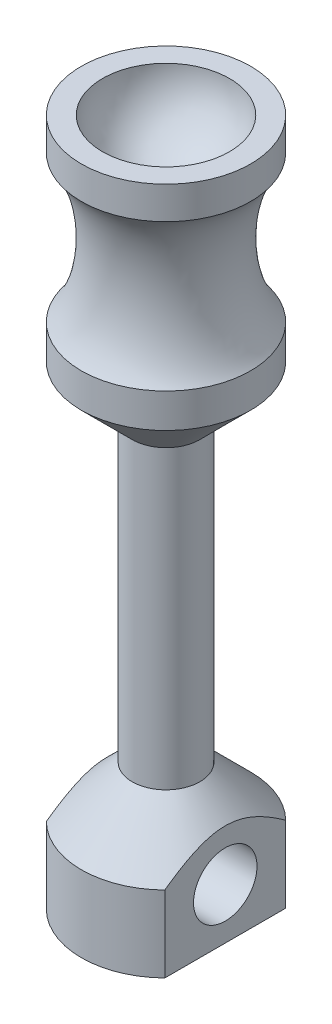
ISO-10303-21;
HEADER;
FILE_DESCRIPTION(('STEP AP214'),'2;1');
FILE_NAME('part.step','',(''),(''),'','','');
FILE_SCHEMA(('AUTOMOTIVE_DESIGN { 1 0 10303 214 1 1 1 1 }'));
ENDSEC;
DATA;
#1=APPLICATION_CONTEXT('core data for automotive mechanical design processes');
#2=APPLICATION_PROTOCOL_DEFINITION('international standard','automotive_design',2000,#1);
#3=PRODUCT_CONTEXT('',#1,'mechanical');
#4=PRODUCT('Part','Part','',(#3));
#5=PRODUCT_RELATED_PRODUCT_CATEGORY('part','',(#4));
#6=PRODUCT_DEFINITION_FORMATION('','',#4);
#7=PRODUCT_DEFINITION_CONTEXT('part definition',#1,'design');
#8=PRODUCT_DEFINITION('design','',#6,#7);
#9=PRODUCT_DEFINITION_SHAPE('','',#8);
#10=(LENGTH_UNIT() NAMED_UNIT(*) SI_UNIT(.MILLI.,.METRE.));
#11=(NAMED_UNIT(*) PLANE_ANGLE_UNIT() SI_UNIT($,.RADIAN.));
#12=(NAMED_UNIT(*) SI_UNIT($,.STERADIAN.) SOLID_ANGLE_UNIT());
#13=UNCERTAINTY_MEASURE_WITH_UNIT(LENGTH_MEASURE(1.E-05),#10,'distance_accuracy_value','');
#14=(GEOMETRIC_REPRESENTATION_CONTEXT(3) GLOBAL_UNCERTAINTY_ASSIGNED_CONTEXT((#13)) GLOBAL_UNIT_ASSIGNED_CONTEXT((#10,
#11,#12)) REPRESENTATION_CONTEXT('',''));
#15=CARTESIAN_POINT('',(0.,0.,0.));
#16=DIRECTION('',(0.,0.,1.));
#17=DIRECTION('',(1.,0.,0.));
#18=AXIS2_PLACEMENT_3D('',#15,#16,#17);
#19=CARTESIAN_POINT('',(0.,54.102,0.));
#20=DIRECTION('',(0.,1.,0.));
#21=DIRECTION('',(0.,0.,1.));
#22=AXIS2_PLACEMENT_3D('',#19,#20,#21);
#23=PLANE('',#22);
#24=CARTESIAN_POINT('',(0.,54.102,0.));
#25=DIRECTION('',(0.,1.,0.));
#26=DIRECTION('',(0.,0.,1.));
#27=AXIS2_PLACEMENT_3D('',#24,#25,#26);
#28=CIRCLE('',#27,6.34999999999999);
#29=CARTESIAN_POINT('',(0.,54.102,6.34999999999999));
#30=VERTEX_POINT('',#29);
#31=EDGE_CURVE('E107',#30,#30,#28,.T.);
#32=ORIENTED_EDGE('',*,*,#31,.T.);
#33=EDGE_LOOP('',(#32));
#34=FACE_BOUND('',#33,.T.);
#35=CARTESIAN_POINT('',(0.,54.102,0.));
#36=DIRECTION('',(0.,1.,0.));
#37=DIRECTION('',(0.,0.,1.));
#38=AXIS2_PLACEMENT_3D('',#35,#36,#37);
#39=CIRCLE('',#38,4.7625);
#40=CARTESIAN_POINT('',(0.,54.102,4.7625));
#41=VERTEX_POINT('',#40);
#42=EDGE_CURVE('E144',#41,#41,#39,.F.);
#43=ORIENTED_EDGE('',*,*,#42,.T.);
#44=EDGE_LOOP('',(#43));
#45=FACE_BOUND('',#44,.T.);
#46=ADVANCED_FACE('F32',(#34,#45),#23,.T.);
#47=CARTESIAN_POINT('',(0.,54.102,0.));
#48=DIRECTION('',(0.,-1.,0.));
#49=DIRECTION('',(0.,0.,-1.));
#50=AXIS2_PLACEMENT_3D('',#47,#48,#49);
#51=CYLINDRICAL_SURFACE('',#50,6.34999999999999);
#52=DIRECTION('',(0.,-1.,0.));
#53=VECTOR('',#52,1.);
#54=CARTESIAN_POINT('',(4.44499999999999,54.102,-4.53480705212471));
#55=LINE('',#54,#53);
#56=CARTESIAN_POINT('',(4.445,8.25500000000001,-4.53480705212471));
#57=VERTEX_POINT('',#56);
#58=CARTESIAN_POINT('',(4.445,2.53999999999995,-4.5348070521247));
#59=VERTEX_POINT('',#58);
#60=EDGE_CURVE('E81',#57,#59,#55,.T.);
#61=ORIENTED_EDGE('',*,*,#60,.T.);
#62=CARTESIAN_POINT('',(0.,2.53999999999995,0.));
#63=DIRECTION('',(0.,1.,0.));
#64=DIRECTION('',(-1.,0.,0.));
#65=AXIS2_PLACEMENT_3D('',#62,#63,#64);
#66=CIRCLE('',#65,6.34999999999999);
#67=CARTESIAN_POINT('',(-4.445,2.53999999999995,-4.53480705212471));
#68=VERTEX_POINT('',#67);
#69=EDGE_CURVE('E71',#59,#68,#66,.T.);
#70=ORIENTED_EDGE('',*,*,#69,.T.);
#71=DIRECTION('',(0.,-1.,0.));
#72=VECTOR('',#71,1.);
#73=CARTESIAN_POINT('',(-4.44499999999999,54.102,-4.53480705212471));
#74=LINE('',#73,#72);
#75=CARTESIAN_POINT('',(-4.445,8.25500000000001,-4.53480705212471));
#76=VERTEX_POINT('',#75);
#77=EDGE_CURVE('E78',#76,#68,#74,.T.);
#78=ORIENTED_EDGE('',*,*,#77,.F.);
#79=CARTESIAN_POINT('',(0.,8.25500000000001,0.));
#80=DIRECTION('',(0.,-1.,0.));
#81=DIRECTION('',(0.,0.,-1.));
#82=AXIS2_PLACEMENT_3D('',#79,#80,#81);
#83=CIRCLE('',#82,6.35);
#84=EDGE_CURVE('E103',#76,#57,#83,.T.);
#85=ORIENTED_EDGE('',*,*,#84,.T.);
#86=EDGE_LOOP('',(#61,#70,#78,#85));
#87=FACE_BOUND('',#86,.T.);
#88=ADVANCED_FACE('F77',(#87),#51,.T.);
#89=DIRECTION('',(0.,-1.,0.));
#90=VECTOR('',#89,1.);
#91=CARTESIAN_POINT('',(-4.44499999999999,54.102,4.53480705212471));
#92=LINE('',#91,#90);
#93=CARTESIAN_POINT('',(-4.44499999999999,2.53999999999995,4.53480705212471));
#94=VERTEX_POINT('',#93);
#95=CARTESIAN_POINT('',(-4.445,8.25500000000001,4.53480705212471));
#96=VERTEX_POINT('',#95);
#97=EDGE_CURVE('E53',#94,#96,#92,.F.);
#98=ORIENTED_EDGE('',*,*,#97,.F.);
#99=CARTESIAN_POINT('',(0.,2.53999999999995,0.));
#100=DIRECTION('',(0.,1.,0.));
#101=DIRECTION('',(-1.,0.,0.));
#102=AXIS2_PLACEMENT_3D('',#99,#100,#101);
#103=CIRCLE('',#102,6.34999999999999);
#104=CARTESIAN_POINT('',(4.445,2.53999999999995,4.5348070521247));
#105=VERTEX_POINT('',#104);
#106=EDGE_CURVE('E46',#94,#105,#103,.T.);
#107=ORIENTED_EDGE('',*,*,#106,.T.);
#108=DIRECTION('',(0.,-1.,0.));
#109=VECTOR('',#108,1.);
#110=CARTESIAN_POINT('',(4.44499999999999,54.102,4.53480705212471));
#111=LINE('',#110,#109);
#112=CARTESIAN_POINT('',(4.445,8.25500000000001,4.53480705212471));
#113=VERTEX_POINT('',#112);
#114=EDGE_CURVE('E86',#105,#113,#111,.F.);
#115=ORIENTED_EDGE('',*,*,#114,.T.);
#116=EDGE_CURVE('E104',#113,#96,#83,.T.);
#117=ORIENTED_EDGE('',*,*,#116,.T.);
#118=EDGE_LOOP('',(#98,#107,#115,#117));
#119=FACE_BOUND('',#118,.T.);
#120=ADVANCED_FACE('F131',(#119),#51,.T.);
#121=CARTESIAN_POINT('',(0.,12.065,0.));
#122=DIRECTION('',(0.,-1.,0.));
#123=DIRECTION('',(0.,0.,-1.));
#124=AXIS2_PLACEMENT_3D('',#121,#122,#123);
#125=CONICAL_SURFACE('',#124,2.54,0.78539816339745);
#126=CARTESIAN_POINT('',(0.,12.065,0.));
#127=DIRECTION('',(0.,-1.,0.));
#128=DIRECTION('',(0.,0.,-1.));
#129=AXIS2_PLACEMENT_3D('',#126,#127,#128);
#130=CIRCLE('',#129,2.54);
#131=CARTESIAN_POINT('',(0.,12.065,-2.54));
#132=VERTEX_POINT('',#131);
#133=EDGE_CURVE('E100',#132,#132,#130,.T.);
#134=ORIENTED_EDGE('',*,*,#133,.T.);
#135=EDGE_LOOP('',(#134));
#136=FACE_BOUND('',#135,.T.);
#137=CARTESIAN_POINT('',(-4.445,-13.1975543182403,-27.444926700917));
#138=CARTESIAN_POINT('',(-4.445,-12.4356043147273,-26.6730093962091));
#139=CARTESIAN_POINT('',(-4.445,-11.6740335414526,-25.9007167867327));
#140=CARTESIAN_POINT('',(-4.445,-10.1515073077864,-24.3545747801718));
#141=CARTESIAN_POINT('',(-4.445,-9.39055252907457,-23.5807247119152));
#142=CARTESIAN_POINT('',(-4.445,-7.86124948825217,-22.0226408137436));
#143=CARTESIAN_POINT('',(-4.445,-7.09291785227884,-21.2383906588543));
#144=CARTESIAN_POINT('',(-4.445,-5.55874112175718,-19.6684106319833));
#145=CARTESIAN_POINT('',(-4.445,-4.7928947810001,-18.8826819787317));
#146=CARTESIAN_POINT('',(-4.445,-3.46572491430304,-17.516052594965));
#147=CARTESIAN_POINT('',(-4.445,-2.90374047903993,-16.9357939142807));
#148=CARTESIAN_POINT('',(-4.445,-1.78184278094422,-15.7732027769578));
#149=CARTESIAN_POINT('',(-4.445,-1.22192965560374,-15.1908701875174));
#150=CARTESIAN_POINT('',(-4.445,-0.103788945365309,-14.0221065643028));
#151=CARTESIAN_POINT('',(-4.445,0.454432130423743,-13.4356692991482));
#152=CARTESIAN_POINT('',(-4.445,1.5665125834218,-12.2589337771987));
#153=CARTESIAN_POINT('',(-4.445,2.12037299541587,-11.6686365012191));
#154=CARTESIAN_POINT('',(-4.445,2.94369666465697,-10.7814556736336));
#155=CARTESIAN_POINT('',(-4.445,3.21561304606535,-10.4868497748998));
#156=CARTESIAN_POINT('',(-4.445,3.75740749413208,-9.89576918086259));
#157=CARTESIAN_POINT('',(-4.445,4.02728556555636,-9.59929448993174));
#158=CARTESIAN_POINT('',(-4.445,4.56468701133505,-9.00368792959814));
#159=CARTESIAN_POINT('',(-4.445,4.83220782938184,-8.70455374845096));
#160=CARTESIAN_POINT('',(-4.445,5.23087017514716,-8.25355681451988));
#161=CARTESIAN_POINT('',(-4.445,5.36331643274224,-8.10284734793688));
#162=CARTESIAN_POINT('',(-4.445,5.62719773312155,-7.80053480996339));
#163=CARTESIAN_POINT('',(-4.445,5.75863273426894,-7.64893170222778));
#164=CARTESIAN_POINT('',(-4.445,6.15008816117915,-7.19385028902806));
#165=CARTESIAN_POINT('',(-4.445,6.40835830006677,-6.88886129443041));
#166=CARTESIAN_POINT('',(-4.445,6.91835407187403,-6.27346091290103));
#167=CARTESIAN_POINT('',(-4.445,7.17008022848333,-5.96304996321199));
#168=CARTESIAN_POINT('',(-4.445,7.54026199846865,-5.49197696661505));
#169=CARTESIAN_POINT('',(-4.445,7.66233551988706,-5.33415959368159));
#170=CARTESIAN_POINT('',(-4.445,7.90349563886727,-5.01626278255211));
#171=CARTESIAN_POINT('',(-4.445,8.02258237117754,-4.85618344691539));
#172=CARTESIAN_POINT('',(-4.445,8.25698140488795,-4.53338954367256));
#173=CARTESIAN_POINT('',(-4.445,8.37229539151736,-4.37067620256233));
#174=CARTESIAN_POINT('',(-4.445,8.59820145584246,-4.04201286938058));
#175=CARTESIAN_POINT('',(-4.445,8.70879420725611,-3.87606334406779));
#176=CARTESIAN_POINT('',(-4.445,8.84558036098231,-3.66252786801582));
#177=CARTESIAN_POINT('',(-4.445,8.87459324262326,-3.61674129452419));
#178=CARTESIAN_POINT('',(-4.445,8.9321356323812,-3.52486163141856));
#179=CARTESIAN_POINT('',(-4.445,8.960665112801,-3.47876852445054));
#180=CARTESIAN_POINT('',(-4.445,9.0454795834033,-3.34000089531721));
#181=CARTESIAN_POINT('',(-4.445,9.10098457124759,-3.24684745206623));
#182=CARTESIAN_POINT('',(-4.445,9.20959648952546,-3.05912061113488));
#183=CARTESIAN_POINT('',(-4.445,9.26270288811155,-2.96454690466901));
#184=CARTESIAN_POINT('',(-4.445,9.36610449445258,-2.7738794663369));
#185=CARTESIAN_POINT('',(-4.445,9.41639974500159,-2.67778575763823));
#186=CARTESIAN_POINT('',(-4.445,9.56125580713605,-2.38931788962122));
#187=CARTESIAN_POINT('',(-4.445,9.65110069734639,-2.19452591460867));
#188=CARTESIAN_POINT('',(-4.445,9.81358868038748,-1.79783920419964));
#189=CARTESIAN_POINT('',(-4.445,9.88624167018346,-1.59594863256496));
#190=CARTESIAN_POINT('',(-4.445,9.98644417695463,-1.26035395296285));
#191=CARTESIAN_POINT('',(-4.445,10.0207752953484,-1.1286783065316));
#192=CARTESIAN_POINT('',(-4.445,10.0788500053781,-0.863011221237728));
#193=CARTESIAN_POINT('',(-4.445,10.1025965471781,-0.729020438485966));
#194=CARTESIAN_POINT('',(-4.445,10.1382472003005,-0.459955681392608));
#195=CARTESIAN_POINT('',(-4.445,10.150194892639,-0.324887565049068));
#196=CARTESIAN_POINT('',(-4.445,10.1617258156051,-0.0542101559532995));
#197=CARTESIAN_POINT('',(-4.445,10.1613086031888,0.0813991560163082));
#198=CARTESIAN_POINT('',(-4.445,10.1481363034913,0.351937858029268));
#199=CARTESIAN_POINT('',(-4.445,10.1353874772754,0.486867558183396));
#200=CARTESIAN_POINT('',(-4.445,10.0982774353544,0.755103296009746));
#201=CARTESIAN_POINT('',(-4.445,10.0739154897547,0.888409231086794));
#202=CARTESIAN_POINT('',(-4.445,10.0146509593817,1.15326912350477));
#203=CARTESIAN_POINT('',(-4.445,9.97970042965531,1.28481220864087));
#204=CARTESIAN_POINT('',(-4.445,9.90074365022842,1.54511953472821));
#205=CARTESIAN_POINT('',(-4.445,9.85673718423251,1.67388370922573));
#206=CARTESIAN_POINT('',(-4.445,9.74944111814335,1.95958930249092));
#207=CARTESIAN_POINT('',(-4.445,9.68406620424318,2.11574300107637));
#208=CARTESIAN_POINT('',(-4.445,9.54395902916257,2.42382969416235));
#209=CARTESIAN_POINT('',(-4.445,9.46922207110004,2.57576052299448));
#210=CARTESIAN_POINT('',(-4.445,9.31225348279556,2.87603020775042));
#211=CARTESIAN_POINT('',(-4.445,9.23000816458699,3.0243618532769));
#212=CARTESIAN_POINT('',(-4.445,9.05970960077827,3.31759873368526));
#213=CARTESIAN_POINT('',(-4.445,8.97165727124649,3.46250450412991));
#214=CARTESIAN_POINT('',(-4.445,8.78967552794909,3.75136290118663));
#215=CARTESIAN_POINT('',(-4.445,8.69568181452256,3.89527482941707));
#216=CARTESIAN_POINT('',(-4.445,8.5038770974588,4.18052823475951));
#217=CARTESIAN_POINT('',(-4.445,8.40606597753632,4.32186963337587));
#218=CARTESIAN_POINT('',(-4.445,8.20746631499176,4.60219327122133));
#219=CARTESIAN_POINT('',(-4.445,8.10668134444104,4.74117804841789));
#220=CARTESIAN_POINT('',(-4.445,7.90258531088484,5.01726756806185));
#221=CARTESIAN_POINT('',(-4.445,7.79927434371107,5.15437238152457));
#222=CARTESIAN_POINT('',(-4.445,7.57131306095592,5.45211176590323));
#223=CARTESIAN_POINT('',(-4.445,7.44624085713256,5.61242292945668));
#224=CARTESIAN_POINT('',(-4.445,7.19370999202695,5.93115676909707));
#225=CARTESIAN_POINT('',(-4.445,7.06625126356562,6.08957939181677));
#226=CARTESIAN_POINT('',(-4.445,6.68092924542125,6.56250379250771));
#227=CARTESIAN_POINT('',(-4.445,6.42014726302877,6.87462706115021));
#228=CARTESIAN_POINT('',(-4.445,5.89308148766931,7.49439442731925));
#229=CARTESIAN_POINT('',(-4.445,5.62679539999551,7.80203656163874));
#230=CARTESIAN_POINT('',(-4.445,5.09028815664784,8.41387718341034));
#231=CARTESIAN_POINT('',(-4.445,4.82006690870514,8.71807558981816));
#232=CARTESIAN_POINT('',(-4.445,4.27613062885287,9.32445609085749));
#233=CARTESIAN_POINT('',(-4.445,4.0024095593474,9.62663275867267));
#234=CARTESIAN_POINT('',(-4.445,3.45270142308725,10.2289230423275));
#235=CARTESIAN_POINT('',(-4.445,3.17671432573903,10.5290366302127));
#236=CARTESIAN_POINT('',(-4.445,2.62304245121503,11.1275417670967));
#237=CARTESIAN_POINT('',(-4.445,2.34535815273853,11.4259337593419));
#238=CARTESIAN_POINT('',(-4.445,1.78857296763342,12.0213929636744));
#239=CARTESIAN_POINT('',(-4.445,1.5094720790336,12.3184601739171));
#240=CARTESIAN_POINT('',(-4.445,0.736125108099581,13.138419567119));
#241=CARTESIAN_POINT('',(-4.445,0.240671016750735,13.660172177429));
#242=CARTESIAN_POINT('',(-4.445,-0.752805954086273,14.7013017833834));
#243=CARTESIAN_POINT('',(-4.445,-1.25082903506361,15.2206785864718));
#244=CARTESIAN_POINT('',(-4.445,-2.24695838399415,16.2557770183495));
#245=CARTESIAN_POINT('',(-4.445,-2.74505797560857,16.7715050761967));
#246=CARTESIAN_POINT('',(-4.445,-3.74264958245462,17.8015223443455));
#247=CARTESIAN_POINT('',(-4.445,-4.24214146714956,18.3158116810406));
#248=CARTESIAN_POINT('',(-4.445,-4.74214323909558,18.8296023992565));
#249=B_SPLINE_CURVE_WITH_KNOTS('',3,(#137,#138,#139,#140,#141,#142,#143,#144,#145,#146,#147,
#148,#149,#150,#151,#152,#153,#154,#155,#156,#157,#158,#159,#160,#161,#162,#163,#164,#165,#166,
#167,#168,#169,#170,#171,#172,#173,#174,#175,#176,#177,#178,#179,#180,#181,#182,#183,#184,#185,
#186,#187,#188,#189,#190,#191,#192,#193,#194,#195,#196,#197,#198,#199,#200,#201,#202,#203,#204,
#205,#206,#207,#208,#209,#210,#211,#212,#213,#214,#215,#216,#217,#218,#219,#220,#221,#222,#223,
#224,#225,#226,#227,#228,#229,#230,#231,#232,#233,#234,#235,#236,#237,#238,#239,#240,#241,#242,
#243,#244,#245,#246,#247,#248),.UNSPECIFIED.,.F.,.F.,(4,2,2,2,2,2,2,2,2,2,2,2,2,2,2,2,2,2,2,2,2,
2,2,2,2,2,2,2,2,2,2,2,2,2,2,2,2,2,2,2,2,2,2,2,2,2,2,2,2,2,2,2,2,2,2,4),(0.,3.25389354993334,
6.50981999546772,9.80351406748909,13.0951662644728,15.5185362842288,17.9420643785174,
20.3709771968224,22.7992951239004,24.0020265108778,25.2047550847892,26.4086579574993,
27.0105661512508,27.6124989963696,28.8113969742965,30.0101987118375,30.6087323482515,
31.2072389331732,31.8054744191375,32.4036242498679,32.5662362596233,32.7288575551832,
33.0541336127811,33.3794814443934,33.7048243218905,34.3477565170784,34.9903176862376,
35.3981846983979,35.8059379574831,36.2121794149324,36.6184354283398,37.0244852837332,
37.4305606630721,37.8385029465295,38.2464549745643,38.753910372328,39.2616213848118,
39.7702771925982,40.2788529499069,40.794441828479,41.3100464251173,41.8250550693997,
42.3400442054172,42.9500024870222,43.5599779644361,44.7800618458437,46.0006650811618,
47.2212969825442,48.4444367810433,49.6675931203448,50.8904190708238,52.1132467233499,
54.2717755177373,56.4304762635791,58.5814514248375,60.7322312804627),.UNSPECIFIED.);
#250=EDGE_CURVE('E40',#96,#76,#249,.F.);
#251=ORIENTED_EDGE('',*,*,#250,.F.);
#252=ORIENTED_EDGE('',*,*,#116,.F.);
#253=CARTESIAN_POINT('',(4.445,-13.1975543182403,-27.444926700917));
#254=CARTESIAN_POINT('',(4.445,-12.4356043147273,-26.6730093962091));
#255=CARTESIAN_POINT('',(4.445,-11.6740335414526,-25.9007167867327));
#256=CARTESIAN_POINT('',(4.445,-10.1515073077864,-24.3545747801718));
#257=CARTESIAN_POINT('',(4.445,-9.39055252907457,-23.5807247119152));
#258=CARTESIAN_POINT('',(4.445,-7.86124948825217,-22.0226408137436));
#259=CARTESIAN_POINT('',(4.445,-7.09291785227884,-21.2383906588543));
#260=CARTESIAN_POINT('',(4.445,-5.55874112175718,-19.6684106319833));
#261=CARTESIAN_POINT('',(4.445,-4.7928947810001,-18.8826819787317));
#262=CARTESIAN_POINT('',(4.445,-3.46572491430304,-17.516052594965));
#263=CARTESIAN_POINT('',(4.445,-2.90374047903993,-16.9357939142807));
#264=CARTESIAN_POINT('',(4.445,-1.78184278094422,-15.7732027769578));
#265=CARTESIAN_POINT('',(4.445,-1.22192965560374,-15.1908701875174));
#266=CARTESIAN_POINT('',(4.445,-0.103788945365309,-14.0221065643028));
#267=CARTESIAN_POINT('',(4.445,0.454432130423743,-13.4356692991482));
#268=CARTESIAN_POINT('',(4.445,1.5665125834218,-12.2589337771987));
#269=CARTESIAN_POINT('',(4.445,2.12037299541587,-11.6686365012191));
#270=CARTESIAN_POINT('',(4.445,2.94369666465697,-10.7814556736336));
#271=CARTESIAN_POINT('',(4.445,3.21561304606535,-10.4868497748998));
#272=CARTESIAN_POINT('',(4.445,3.75740749413208,-9.89576918086259));
#273=CARTESIAN_POINT('',(4.445,4.02728556555636,-9.59929448993174));
#274=CARTESIAN_POINT('',(4.445,4.56468701133505,-9.00368792959814));
#275=CARTESIAN_POINT('',(4.445,4.83220782938184,-8.70455374845096));
#276=CARTESIAN_POINT('',(4.445,5.23087017514716,-8.25355681451988));
#277=CARTESIAN_POINT('',(4.445,5.36331643274224,-8.10284734793688));
#278=CARTESIAN_POINT('',(4.445,5.62719773312155,-7.80053480996339));
#279=CARTESIAN_POINT('',(4.445,5.75863273426894,-7.64893170222778));
#280=CARTESIAN_POINT('',(4.445,6.15008816117915,-7.19385028902806));
#281=CARTESIAN_POINT('',(4.445,6.40835830006677,-6.88886129443041));
#282=CARTESIAN_POINT('',(4.445,6.91835407187403,-6.27346091290103));
#283=CARTESIAN_POINT('',(4.445,7.17008022848333,-5.96304996321199));
#284=CARTESIAN_POINT('',(4.445,7.54026199846865,-5.49197696661505));
#285=CARTESIAN_POINT('',(4.445,7.66233551988706,-5.33415959368159));
#286=CARTESIAN_POINT('',(4.445,7.90349563886727,-5.01626278255211));
#287=CARTESIAN_POINT('',(4.445,8.02258237117754,-4.85618344691539));
#288=CARTESIAN_POINT('',(4.445,8.25698140488795,-4.53338954367256));
#289=CARTESIAN_POINT('',(4.445,8.37229539151736,-4.37067620256233));
#290=CARTESIAN_POINT('',(4.445,8.59820145584246,-4.04201286938058));
#291=CARTESIAN_POINT('',(4.445,8.70879420725611,-3.87606334406779));
#292=CARTESIAN_POINT('',(4.445,8.84558036098231,-3.66252786801582));
#293=CARTESIAN_POINT('',(4.445,8.87459324262326,-3.61674129452419));
#294=CARTESIAN_POINT('',(4.445,8.9321356323812,-3.52486163141856));
#295=CARTESIAN_POINT('',(4.445,8.960665112801,-3.47876852445054));
#296=CARTESIAN_POINT('',(4.445,9.0454795834033,-3.34000089531721));
#297=CARTESIAN_POINT('',(4.445,9.10098457124759,-3.24684745206623));
#298=CARTESIAN_POINT('',(4.445,9.20959648952546,-3.05912061113488));
#299=CARTESIAN_POINT('',(4.445,9.26270288811155,-2.96454690466901));
#300=CARTESIAN_POINT('',(4.445,9.36610449445258,-2.7738794663369));
#301=CARTESIAN_POINT('',(4.445,9.41639974500159,-2.67778575763823));
#302=CARTESIAN_POINT('',(4.445,9.56125580713605,-2.38931788962122));
#303=CARTESIAN_POINT('',(4.445,9.65110069734639,-2.19452591460867));
#304=CARTESIAN_POINT('',(4.445,9.81358868038748,-1.79783920419964));
#305=CARTESIAN_POINT('',(4.445,9.88624167018346,-1.59594863256496));
#306=CARTESIAN_POINT('',(4.445,9.98644417695463,-1.26035395296285));
#307=CARTESIAN_POINT('',(4.445,10.0207752953484,-1.1286783065316));
#308=CARTESIAN_POINT('',(4.445,10.0788500053781,-0.863011221237728));
#309=CARTESIAN_POINT('',(4.445,10.1025965471781,-0.729020438485966));
#310=CARTESIAN_POINT('',(4.445,10.1382472003005,-0.459955681392608));
#311=CARTESIAN_POINT('',(4.445,10.150194892639,-0.324887565049068));
#312=CARTESIAN_POINT('',(4.445,10.1617258156051,-0.0542101559532995));
#313=CARTESIAN_POINT('',(4.445,10.1613086031888,0.0813991560163082));
#314=CARTESIAN_POINT('',(4.445,10.1481363034913,0.351937858029268));
#315=CARTESIAN_POINT('',(4.445,10.1353874772754,0.486867558183396));
#316=CARTESIAN_POINT('',(4.445,10.0982774353544,0.755103296009746));
#317=CARTESIAN_POINT('',(4.445,10.0739154897547,0.888409231086794));
#318=CARTESIAN_POINT('',(4.445,10.0146509593817,1.15326912350477));
#319=CARTESIAN_POINT('',(4.445,9.97970042965531,1.28481220864087));
#320=CARTESIAN_POINT('',(4.445,9.90074365022842,1.54511953472821));
#321=CARTESIAN_POINT('',(4.445,9.85673718423251,1.67388370922573));
#322=CARTESIAN_POINT('',(4.445,9.74944111814335,1.95958930249092));
#323=CARTESIAN_POINT('',(4.445,9.68406620424318,2.11574300107637));
#324=CARTESIAN_POINT('',(4.445,9.54395902916257,2.42382969416235));
#325=CARTESIAN_POINT('',(4.445,9.46922207110004,2.57576052299448));
#326=CARTESIAN_POINT('',(4.445,9.31225348279556,2.87603020775042));
#327=CARTESIAN_POINT('',(4.445,9.23000816458699,3.0243618532769));
#328=CARTESIAN_POINT('',(4.445,9.05970960077827,3.31759873368526));
#329=CARTESIAN_POINT('',(4.445,8.97165727124649,3.46250450412991));
#330=CARTESIAN_POINT('',(4.445,8.78967552794909,3.75136290118663));
#331=CARTESIAN_POINT('',(4.445,8.69568181452256,3.89527482941707));
#332=CARTESIAN_POINT('',(4.445,8.5038770974588,4.18052823475951));
#333=CARTESIAN_POINT('',(4.445,8.40606597753632,4.32186963337587));
#334=CARTESIAN_POINT('',(4.445,8.20746631499176,4.60219327122133));
#335=CARTESIAN_POINT('',(4.445,8.10668134444104,4.74117804841789));
#336=CARTESIAN_POINT('',(4.445,7.90258531088484,5.01726756806185));
#337=CARTESIAN_POINT('',(4.445,7.79927434371107,5.15437238152457));
#338=CARTESIAN_POINT('',(4.445,7.57131306095592,5.45211176590323));
#339=CARTESIAN_POINT('',(4.445,7.44624085713256,5.61242292945668));
#340=CARTESIAN_POINT('',(4.445,7.19370999202695,5.93115676909707));
#341=CARTESIAN_POINT('',(4.445,7.06625126356562,6.08957939181677));
#342=CARTESIAN_POINT('',(4.445,6.68092924542125,6.56250379250771));
#343=CARTESIAN_POINT('',(4.445,6.42014726302877,6.87462706115021));
#344=CARTESIAN_POINT('',(4.445,5.89308148766931,7.49439442731925));
#345=CARTESIAN_POINT('',(4.445,5.62679539999551,7.80203656163874));
#346=CARTESIAN_POINT('',(4.445,5.09028815664784,8.41387718341034));
#347=CARTESIAN_POINT('',(4.445,4.82006690870514,8.71807558981816));
#348=CARTESIAN_POINT('',(4.445,4.27613062885287,9.32445609085749));
#349=CARTESIAN_POINT('',(4.445,4.0024095593474,9.62663275867267));
#350=CARTESIAN_POINT('',(4.445,3.45270142308725,10.2289230423275));
#351=CARTESIAN_POINT('',(4.445,3.17671432573903,10.5290366302127));
#352=CARTESIAN_POINT('',(4.445,2.62304245121503,11.1275417670967));
#353=CARTESIAN_POINT('',(4.445,2.34535815273853,11.4259337593419));
#354=CARTESIAN_POINT('',(4.445,1.78857296763342,12.0213929636744));
#355=CARTESIAN_POINT('',(4.445,1.5094720790336,12.3184601739171));
#356=CARTESIAN_POINT('',(4.445,0.736125108099581,13.138419567119));
#357=CARTESIAN_POINT('',(4.445,0.240671016750735,13.660172177429));
#358=CARTESIAN_POINT('',(4.445,-0.752805954086273,14.7013017833834));
#359=CARTESIAN_POINT('',(4.445,-1.25082903506361,15.2206785864718));
#360=CARTESIAN_POINT('',(4.445,-2.24695838399415,16.2557770183495));
#361=CARTESIAN_POINT('',(4.445,-2.74505797560857,16.7715050761967));
#362=CARTESIAN_POINT('',(4.445,-3.74264958245462,17.8015223443455));
#363=CARTESIAN_POINT('',(4.445,-4.24214146714956,18.3158116810406));
#364=CARTESIAN_POINT('',(4.445,-4.74214323909558,18.8296023992565));
#365=B_SPLINE_CURVE_WITH_KNOTS('',3,(#253,#254,#255,#256,#257,#258,#259,#260,#261,#262,#263,
#264,#265,#266,#267,#268,#269,#270,#271,#272,#273,#274,#275,#276,#277,#278,#279,#280,#281,#282,
#283,#284,#285,#286,#287,#288,#289,#290,#291,#292,#293,#294,#295,#296,#297,#298,#299,#300,#301,
#302,#303,#304,#305,#306,#307,#308,#309,#310,#311,#312,#313,#314,#315,#316,#317,#318,#319,#320,
#321,#322,#323,#324,#325,#326,#327,#328,#329,#330,#331,#332,#333,#334,#335,#336,#337,#338,#339,
#340,#341,#342,#343,#344,#345,#346,#347,#348,#349,#350,#351,#352,#353,#354,#355,#356,#357,#358,
#359,#360,#361,#362,#363,#364),.UNSPECIFIED.,.F.,.F.,(4,2,2,2,2,2,2,2,2,2,2,2,2,2,2,2,2,2,2,2,2,
2,2,2,2,2,2,2,2,2,2,2,2,2,2,2,2,2,2,2,2,2,2,2,2,2,2,2,2,2,2,2,2,2,2,4),(0.,3.25389354993334,
6.50981999546772,9.80351406748909,13.0951662644728,15.5185362842288,17.9420643785174,
20.3709771968224,22.7992951239004,24.0020265108778,25.2047550847892,26.4086579574993,
27.0105661512508,27.6124989963696,28.8113969742965,30.0101987118375,30.6087323482515,
31.2072389331732,31.8054744191375,32.4036242498679,32.5662362596233,32.7288575551832,
33.0541336127811,33.3794814443934,33.7048243218905,34.3477565170784,34.9903176862376,
35.3981846983979,35.8059379574831,36.2121794149324,36.6184354283398,37.0244852837332,
37.4305606630721,37.8385029465295,38.2464549745643,38.753910372328,39.2616213848118,
39.7702771925982,40.2788529499069,40.794441828479,41.3100464251173,41.8250550693997,
42.3400442054172,42.9500024870222,43.5599779644361,44.7800618458437,46.0006650811618,
47.2212969825442,48.4444367810433,49.6675931203448,50.8904190708238,52.1132467233499,
54.2717755177373,56.4304762635791,58.5814514248375,60.7322312804627),.UNSPECIFIED.);
#366=EDGE_CURVE('E110',#113,#57,#365,.F.);
#367=ORIENTED_EDGE('',*,*,#366,.T.);
#368=ORIENTED_EDGE('',*,*,#84,.F.);
#369=EDGE_LOOP('',(#251,#252,#367,#368));
#370=FACE_BOUND('',#369,.T.);
#371=ADVANCED_FACE('F126',(#136,#370),#125,.T.);
#372=CARTESIAN_POINT('',(0.,0.,0.));
#373=DIRECTION('',(0.,-1.,0.));
#374=DIRECTION('',(0.,0.,-1.));
#375=AXIS2_PLACEMENT_3D('',#372,#373,#374);
#376=CYLINDRICAL_SURFACE('',#375,2.54);
#377=ORIENTED_EDGE('',*,*,#133,.F.);
#378=EDGE_LOOP('',(#377));
#379=FACE_BOUND('',#378,.T.);
#380=CARTESIAN_POINT('',(0.,34.29,0.));
#381=DIRECTION('',(0.,-1.,0.));
#382=DIRECTION('',(0.,0.,-1.));
#383=AXIS2_PLACEMENT_3D('',#380,#381,#382);
#384=CIRCLE('',#383,2.54);
#385=CARTESIAN_POINT('',(0.,34.29,-2.54));
#386=VERTEX_POINT('',#385);
#387=EDGE_CURVE('E97',#386,#386,#384,.T.);
#388=ORIENTED_EDGE('',*,*,#387,.T.);
#389=EDGE_LOOP('',(#388));
#390=FACE_BOUND('',#389,.T.);
#391=ADVANCED_FACE('F130',(#379,#390),#376,.T.);
#392=CARTESIAN_POINT('',(0.,38.1,0.));
#393=DIRECTION('',(0.,1.,0.));
#394=DIRECTION('',(0.,0.,1.));
#395=AXIS2_PLACEMENT_3D('',#392,#393,#394);
#396=CONICAL_SURFACE('',#395,6.35,0.785398163397449);
#397=ORIENTED_EDGE('',*,*,#387,.F.);
#398=EDGE_LOOP('',(#397));
#399=FACE_BOUND('',#398,.T.);
#400=CARTESIAN_POINT('',(0.,38.1,0.));
#401=DIRECTION('',(0.,-1.,0.));
#402=DIRECTION('',(0.,0.,-1.));
#403=AXIS2_PLACEMENT_3D('',#400,#401,#402);
#404=CIRCLE('',#403,6.35);
#405=CARTESIAN_POINT('',(0.,38.1,-6.35));
#406=VERTEX_POINT('',#405);
#407=EDGE_CURVE('E94',#406,#406,#404,.T.);
#408=ORIENTED_EDGE('',*,*,#407,.T.);
#409=EDGE_LOOP('',(#408));
#410=FACE_BOUND('',#409,.T.);
#411=ADVANCED_FACE('F181',(#399,#410),#396,.T.);
#412=CARTESIAN_POINT('',(0.,40.6652386859688,0.));
#413=DIRECTION('',(0.,-1.,0.));
#414=DIRECTION('',(0.,0.,-1.));
#415=AXIS2_PLACEMENT_3D('',#412,#413,#414);
#416=CIRCLE('',#415,6.34999999999999);
#417=CARTESIAN_POINT('',(0.,40.6652386859688,-6.34999999999999));
#418=VERTEX_POINT('',#417);
#419=EDGE_CURVE('E146',#418,#418,#416,.T.);
#420=ORIENTED_EDGE('',*,*,#419,.T.);
#421=EDGE_LOOP('',(#420));
#422=FACE_BOUND('',#421,.T.);
#423=ORIENTED_EDGE('',*,*,#407,.F.);
#424=EDGE_LOOP('',(#423));
#425=FACE_BOUND('',#424,.T.);
#426=ADVANCED_FACE('F34',(#422,#425),#51,.T.);
#427=CARTESIAN_POINT('',(4.445,14.6049999999999,-6.35));
#428=DIRECTION('',(-1.,0.,0.));
#429=DIRECTION('',(0.,-1.,0.));
#430=AXIS2_PLACEMENT_3D('',#427,#428,#429);
#431=PLANE('',#430);
#432=CARTESIAN_POINT('',(4.445,6.34999999999995,0.));
#433=DIRECTION('',(-1.,0.,0.));
#434=DIRECTION('',(0.,-1.,0.));
#435=AXIS2_PLACEMENT_3D('',#432,#433,#434);
#436=CIRCLE('',#435,2.38124999999999);
#437=CARTESIAN_POINT('',(4.445,3.96874999999996,0.));
#438=VERTEX_POINT('',#437);
#439=EDGE_CURVE('E89',#438,#438,#436,.T.);
#440=ORIENTED_EDGE('',*,*,#439,.T.);
#441=EDGE_LOOP('',(#440));
#442=FACE_BOUND('',#441,.T.);
#443=ORIENTED_EDGE('',*,*,#114,.F.);
#444=DIRECTION('',(0.,0.,-1.));
#445=VECTOR('',#444,1.);
#446=CARTESIAN_POINT('',(4.445,2.53999999999995,-6.35));
#447=LINE('',#446,#445);
#448=EDGE_CURVE('E82',#105,#59,#447,.T.);
#449=ORIENTED_EDGE('',*,*,#448,.T.);
#450=ORIENTED_EDGE('',*,*,#60,.F.);
#451=ORIENTED_EDGE('',*,*,#366,.F.);
#452=EDGE_LOOP('',(#443,#449,#450,#451));
#453=FACE_BOUND('',#452,.T.);
#454=ADVANCED_FACE('F123',(#442,#453),#431,.F.);
#455=CARTESIAN_POINT('',(-4.445,14.6049999999999,-6.35));
#456=DIRECTION('',(-1.,0.,0.));
#457=DIRECTION('',(0.,-1.,0.));
#458=AXIS2_PLACEMENT_3D('',#455,#456,#457);
#459=PLANE('',#458);
#460=DIRECTION('',(0.,0.,-1.));
#461=VECTOR('',#460,1.);
#462=CARTESIAN_POINT('',(-4.445,2.53999999999995,-6.35));
#463=LINE('',#462,#461);
#464=EDGE_CURVE('E11',#94,#68,#463,.T.);
#465=ORIENTED_EDGE('',*,*,#464,.F.);
#466=ORIENTED_EDGE('',*,*,#97,.T.);
#467=ORIENTED_EDGE('',*,*,#250,.T.);
#468=ORIENTED_EDGE('',*,*,#77,.T.);
#469=EDGE_LOOP('',(#465,#466,#467,#468));
#470=FACE_BOUND('',#469,.T.);
#471=CARTESIAN_POINT('',(-4.44499999999999,6.34999999999995,0.));
#472=DIRECTION('',(-1.,0.,0.));
#473=DIRECTION('',(0.,0.,1.));
#474=AXIS2_PLACEMENT_3D('',#471,#472,#473);
#475=CIRCLE('',#474,2.38124999999999);
#476=CARTESIAN_POINT('',(-4.44499999999999,6.34999999999995,2.38124999999999));
#477=VERTEX_POINT('',#476);
#478=EDGE_CURVE('E152',#477,#477,#475,.T.);
#479=ORIENTED_EDGE('',*,*,#478,.F.);
#480=EDGE_LOOP('',(#479));
#481=FACE_BOUND('',#480,.T.);
#482=ADVANCED_FACE('F84',(#470,#481),#459,.T.);
#483=CARTESIAN_POINT('',(-4.44499999999999,6.34999999999995,0.));
#484=DIRECTION('',(-1.,0.,0.));
#485=DIRECTION('',(0.,0.,1.));
#486=AXIS2_PLACEMENT_3D('',#483,#484,#485);
#487=CYLINDRICAL_SURFACE('',#486,2.38124999999999);
#488=ORIENTED_EDGE('',*,*,#478,.T.);
#489=EDGE_LOOP('',(#488));
#490=FACE_BOUND('',#489,.T.);
#491=ORIENTED_EDGE('',*,*,#439,.F.);
#492=EDGE_LOOP('',(#491));
#493=FACE_BOUND('',#492,.T.);
#494=ADVANCED_FACE('F167',(#490,#493),#487,.F.);
#495=CARTESIAN_POINT('',(7.93749999999999,46.1645,0.));
#496=DIRECTION('',(0.,0.,1.));
#497=DIRECTION('',(0.,-1.,0.));
#498=AXIS2_PLACEMENT_3D('',#495,#496,#497);
#499=ELLIPSE('',#498,6.35,3.175);
#500=CARTESIAN_POINT('',(0.,0.,0.));
#501=DIRECTION('',(0.,-1.,0.));
#502=AXIS1_PLACEMENT('',#500,#501);
#503=SURFACE_OF_REVOLUTION('',#499,#502);
#504=ORIENTED_EDGE('',*,*,#419,.F.);
#505=EDGE_LOOP('',(#504));
#506=FACE_BOUND('',#505,.T.);
#507=CARTESIAN_POINT('',(0.,51.6637613140312,0.));
#508=DIRECTION('',(0.,-1.,0.));
#509=DIRECTION('',(0.,0.,-1.));
#510=AXIS2_PLACEMENT_3D('',#507,#508,#509);
#511=CIRCLE('',#510,6.34999999999999);
#512=CARTESIAN_POINT('',(0.,51.6637613140312,-6.34999999999999));
#513=VERTEX_POINT('',#512);
#514=EDGE_CURVE('E148',#513,#513,#511,.F.);
#515=ORIENTED_EDGE('',*,*,#514,.F.);
#516=EDGE_LOOP('',(#515));
#517=FACE_BOUND('',#516,.T.);
#518=ADVANCED_FACE('F163',(#506,#517),#503,.T.);
#519=ORIENTED_EDGE('',*,*,#514,.T.);
#520=EDGE_LOOP('',(#519));
#521=FACE_BOUND('',#520,.T.);
#522=ORIENTED_EDGE('',*,*,#31,.F.);
#523=EDGE_LOOP('',(#522));
#524=FACE_BOUND('',#523,.T.);
#525=ADVANCED_FACE('F139',(#521,#524),#51,.T.);
#526=CARTESIAN_POINT('',(0.,54.102,0.));
#527=DIRECTION('',(0.,0.,-1.));
#528=DIRECTION('',(0.,-1.,0.));
#529=AXIS2_PLACEMENT_3D('',#526,#527,#528);
#530=SPHERICAL_SURFACE('',#529,4.7625);
#531=CARTESIAN_POINT('',(0.,54.102,0.));
#532=DIRECTION('',(0.,1.,0.));
#533=DIRECTION('',(0.,0.,1.));
#534=AXIS2_PLACEMENT_3D('',#531,#532,#533);
#535=SPHERICAL_SURFACE('',#534,4.7625);
#536=ORIENTED_EDGE('',*,*,#42,.F.);
#537=EDGE_LOOP('',(#536));
#538=FACE_BOUND('',#537,.T.);
#539=ADVANCED_FACE('F169',(#538),#535,.F.);
#540=CARTESIAN_POINT('',(-6.35,2.53999999999995,11.207574186507));
#541=DIRECTION('',(0.,1.,0.));
#542=DIRECTION('',(-1.,0.,0.));
#543=AXIS2_PLACEMENT_3D('',#540,#541,#542);
#544=PLANE('',#543);
#545=ORIENTED_EDGE('',*,*,#106,.F.);
#546=ORIENTED_EDGE('',*,*,#464,.T.);
#547=ORIENTED_EDGE('',*,*,#69,.F.);
#548=ORIENTED_EDGE('',*,*,#448,.F.);
#549=EDGE_LOOP('',(#545,#546,#547,#548));
#550=FACE_BOUND('',#549,.T.);
#551=ADVANCED_FACE('F70',(#550),#544,.F.);
#552=CLOSED_SHELL('',(#46,#88,#120,#371,#391,#411,#426,#454,#482,#494,#518,#525,#539,#551));
#553=MANIFOLD_SOLID_BREP('B2',#552);
#554=ADVANCED_BREP_SHAPE_REPRESENTATION('',(#18,#553),#14);
#555=SHAPE_DEFINITION_REPRESENTATION(#9,#554);
ENDSEC;
END-ISO-10303-21;
